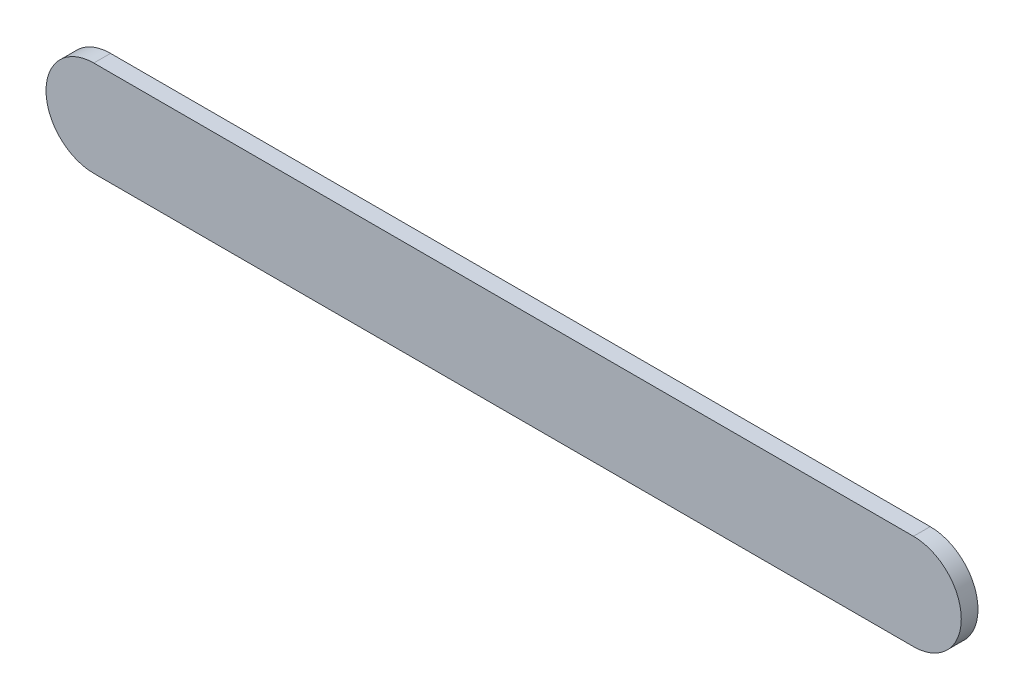
ISO-10303-21;
HEADER;
FILE_DESCRIPTION(('STEP AP214'),'2;1');
FILE_NAME('part.step','',(''),(''),'','','');
FILE_SCHEMA(('AUTOMOTIVE_DESIGN { 1 0 10303 214 1 1 1 1 }'));
ENDSEC;
DATA;
#1=APPLICATION_CONTEXT('core data for automotive mechanical design processes');
#2=APPLICATION_PROTOCOL_DEFINITION('international standard','automotive_design',2000,#1);
#3=PRODUCT_CONTEXT('',#1,'mechanical');
#4=PRODUCT('Part','Part','',(#3));
#5=PRODUCT_RELATED_PRODUCT_CATEGORY('part','',(#4));
#6=PRODUCT_DEFINITION_FORMATION('','',#4);
#7=PRODUCT_DEFINITION_CONTEXT('part definition',#1,'design');
#8=PRODUCT_DEFINITION('design','',#6,#7);
#9=PRODUCT_DEFINITION_SHAPE('','',#8);
#10=(LENGTH_UNIT() NAMED_UNIT(*) SI_UNIT(.MILLI.,.METRE.));
#11=(NAMED_UNIT(*) PLANE_ANGLE_UNIT() SI_UNIT($,.RADIAN.));
#12=(NAMED_UNIT(*) SI_UNIT($,.STERADIAN.) SOLID_ANGLE_UNIT());
#13=UNCERTAINTY_MEASURE_WITH_UNIT(LENGTH_MEASURE(1.E-05),#10,'distance_accuracy_value','');
#14=(GEOMETRIC_REPRESENTATION_CONTEXT(3) GLOBAL_UNCERTAINTY_ASSIGNED_CONTEXT((#13)) GLOBAL_UNIT_ASSIGNED_CONTEXT((#10,
#11,#12)) REPRESENTATION_CONTEXT('',''));
#15=CARTESIAN_POINT('',(0.,0.,0.));
#16=DIRECTION('',(0.,0.,1.));
#17=DIRECTION('',(1.,0.,0.));
#18=AXIS2_PLACEMENT_3D('',#15,#16,#17);
#19=CARTESIAN_POINT('',(89.7,-141.485,1.635));
#20=DIRECTION('',(0.,0.,1.));
#21=DIRECTION('',(1.,0.,0.));
#22=AXIS2_PLACEMENT_3D('',#19,#20,#21);
#23=PLANE('',#22);
#24=DIRECTION('',(-1.,0.,0.));
#25=VECTOR('',#24,1.);
#26=CARTESIAN_POINT('',(89.7,-141.485,1.635));
#27=LINE('',#26,#25);
#28=CARTESIAN_POINT('',(89.7,-141.485,1.635));
#29=VERTEX_POINT('',#28);
#30=CARTESIAN_POINT('',(87.985,-141.485,1.635));
#31=VERTEX_POINT('',#30);
#32=EDGE_CURVE('E70',#29,#31,#27,.T.);
#33=ORIENTED_EDGE('',*,*,#32,.T.);
#34=CARTESIAN_POINT('',(87.985,-141.585,1.635));
#35=DIRECTION('',(0.,0.,1.));
#36=DIRECTION('',(1.42108547152E-13,1.,0.));
#37=AXIS2_PLACEMENT_3D('',#34,#35,#36);
#38=CIRCLE('',#37,0.09999999999999);
#39=CARTESIAN_POINT('',(87.985,-141.685,1.635));
#40=VERTEX_POINT('',#39);
#41=EDGE_CURVE('E68',#31,#40,#38,.T.);
#42=ORIENTED_EDGE('',*,*,#41,.T.);
#43=DIRECTION('',(1.,0.,0.));
#44=VECTOR('',#43,1.);
#45=CARTESIAN_POINT('',(87.985,-141.685,1.635));
#46=LINE('',#45,#44);
#47=CARTESIAN_POINT('',(89.7,-141.685,1.635));
#48=VERTEX_POINT('',#47);
#49=EDGE_CURVE('E56',#40,#48,#46,.T.);
#50=ORIENTED_EDGE('',*,*,#49,.T.);
#51=CARTESIAN_POINT('',(89.7,-141.585,1.635));
#52=DIRECTION('',(0.,0.,1.));
#53=DIRECTION('',(-1.42108547152E-13,-1.,0.));
#54=AXIS2_PLACEMENT_3D('',#51,#52,#53);
#55=CIRCLE('',#54,0.09999999999999);
#56=EDGE_CURVE('E11',#48,#29,#55,.T.);
#57=ORIENTED_EDGE('',*,*,#56,.T.);
#58=EDGE_LOOP('',(#33,#42,#50,#57));
#59=FACE_BOUND('',#58,.T.);
#60=ADVANCED_FACE('F17',(#59),#23,.T.);
#61=CARTESIAN_POINT('',(89.7,-141.485,1.6));
#62=DIRECTION('',(0.,0.,1.));
#63=DIRECTION('',(1.,0.,0.));
#64=AXIS2_PLACEMENT_3D('',#61,#62,#63);
#65=PLANE('',#64);
#66=CARTESIAN_POINT('',(89.7,-141.585,1.6));
#67=DIRECTION('',(0.,0.,1.));
#68=DIRECTION('',(-1.42108547152E-13,-1.,0.));
#69=AXIS2_PLACEMENT_3D('',#66,#67,#68);
#70=CIRCLE('',#69,0.09999999999999);
#71=CARTESIAN_POINT('',(89.7,-141.685,1.6));
#72=VERTEX_POINT('',#71);
#73=CARTESIAN_POINT('',(89.7,-141.485,1.6));
#74=VERTEX_POINT('',#73);
#75=EDGE_CURVE('E26',#72,#74,#70,.T.);
#76=ORIENTED_EDGE('',*,*,#75,.F.);
#77=DIRECTION('',(1.,0.,0.));
#78=VECTOR('',#77,1.);
#79=CARTESIAN_POINT('',(87.985,-141.685,1.6));
#80=LINE('',#79,#78);
#81=CARTESIAN_POINT('',(87.985,-141.685,1.6));
#82=VERTEX_POINT('',#81);
#83=EDGE_CURVE('E75',#82,#72,#80,.T.);
#84=ORIENTED_EDGE('',*,*,#83,.F.);
#85=CARTESIAN_POINT('',(87.985,-141.585,1.6));
#86=DIRECTION('',(0.,0.,1.));
#87=DIRECTION('',(1.42108547152E-13,1.,0.));
#88=AXIS2_PLACEMENT_3D('',#85,#86,#87);
#89=CIRCLE('',#88,0.09999999999999);
#90=CARTESIAN_POINT('',(87.985,-141.485,1.6));
#91=VERTEX_POINT('',#90);
#92=EDGE_CURVE('E79',#91,#82,#89,.T.);
#93=ORIENTED_EDGE('',*,*,#92,.F.);
#94=DIRECTION('',(-1.,0.,0.));
#95=VECTOR('',#94,1.);
#96=CARTESIAN_POINT('',(89.7,-141.485,1.6));
#97=LINE('',#96,#95);
#98=EDGE_CURVE('E104',#74,#91,#97,.T.);
#99=ORIENTED_EDGE('',*,*,#98,.F.);
#100=EDGE_LOOP('',(#76,#84,#93,#99));
#101=FACE_BOUND('',#100,.T.);
#102=ADVANCED_FACE('F122',(#101),#65,.F.);
#103=CARTESIAN_POINT('',(89.7,-141.585,1.6));
#104=DIRECTION('',(0.,0.,-1.));
#105=DIRECTION('',(-1.42108547152E-13,-1.,0.));
#106=AXIS2_PLACEMENT_3D('',#103,#104,#105);
#107=CYLINDRICAL_SURFACE('',#106,0.09999999999999);
#108=ORIENTED_EDGE('',*,*,#75,.T.);
#109=DIRECTION('',(0.,0.,1.));
#110=VECTOR('',#109,1.);
#111=CARTESIAN_POINT('',(89.7,-141.485,1.6));
#112=LINE('',#111,#110);
#113=EDGE_CURVE('E86',#74,#29,#112,.T.);
#114=ORIENTED_EDGE('',*,*,#113,.T.);
#115=ORIENTED_EDGE('',*,*,#56,.F.);
#116=DIRECTION('',(0.,0.,1.));
#117=VECTOR('',#116,1.);
#118=CARTESIAN_POINT('',(89.7,-141.685,1.6));
#119=LINE('',#118,#117);
#120=EDGE_CURVE('E63',#72,#48,#119,.T.);
#121=ORIENTED_EDGE('',*,*,#120,.F.);
#122=EDGE_LOOP('',(#108,#114,#115,#121));
#123=FACE_BOUND('',#122,.T.);
#124=ADVANCED_FACE('F114',(#123),#107,.T.);
#125=CARTESIAN_POINT('',(87.985,-141.685,1.6));
#126=DIRECTION('',(0.,1.,0.));
#127=DIRECTION('',(1.,0.,0.));
#128=AXIS2_PLACEMENT_3D('',#125,#126,#127);
#129=PLANE('',#128);
#130=ORIENTED_EDGE('',*,*,#83,.T.);
#131=ORIENTED_EDGE('',*,*,#120,.T.);
#132=ORIENTED_EDGE('',*,*,#49,.F.);
#133=DIRECTION('',(0.,0.,1.));
#134=VECTOR('',#133,1.);
#135=CARTESIAN_POINT('',(87.985,-141.685,1.6));
#136=LINE('',#135,#134);
#137=EDGE_CURVE('E61',#82,#40,#136,.T.);
#138=ORIENTED_EDGE('',*,*,#137,.F.);
#139=EDGE_LOOP('',(#130,#131,#132,#138));
#140=FACE_BOUND('',#139,.T.);
#141=ADVANCED_FACE('F59',(#140),#129,.F.);
#142=CARTESIAN_POINT('',(87.985,-141.585,1.6));
#143=DIRECTION('',(0.,0.,-1.));
#144=DIRECTION('',(1.42108547152E-13,1.,0.));
#145=AXIS2_PLACEMENT_3D('',#142,#143,#144);
#146=CYLINDRICAL_SURFACE('',#145,0.09999999999999);
#147=ORIENTED_EDGE('',*,*,#92,.T.);
#148=ORIENTED_EDGE('',*,*,#137,.T.);
#149=ORIENTED_EDGE('',*,*,#41,.F.);
#150=DIRECTION('',(0.,0.,1.));
#151=VECTOR('',#150,1.);
#152=CARTESIAN_POINT('',(87.985,-141.485,1.6));
#153=LINE('',#152,#151);
#154=EDGE_CURVE('E101',#91,#31,#153,.T.);
#155=ORIENTED_EDGE('',*,*,#154,.F.);
#156=EDGE_LOOP('',(#147,#148,#149,#155));
#157=FACE_BOUND('',#156,.T.);
#158=ADVANCED_FACE('F77',(#157),#146,.T.);
#159=CARTESIAN_POINT('',(89.7,-141.485,1.6));
#160=DIRECTION('',(0.,-1.,0.));
#161=DIRECTION('',(0.,0.,-1.));
#162=AXIS2_PLACEMENT_3D('',#159,#160,#161);
#163=PLANE('',#162);
#164=ORIENTED_EDGE('',*,*,#98,.T.);
#165=ORIENTED_EDGE('',*,*,#154,.T.);
#166=ORIENTED_EDGE('',*,*,#32,.F.);
#167=ORIENTED_EDGE('',*,*,#113,.F.);
#168=EDGE_LOOP('',(#164,#165,#166,#167));
#169=FACE_BOUND('',#168,.T.);
#170=ADVANCED_FACE('F121',(#169),#163,.F.);
#171=CLOSED_SHELL('',(#60,#102,#124,#141,#158,#170));
#172=MANIFOLD_SOLID_BREP('B1',#171);
#173=ADVANCED_BREP_SHAPE_REPRESENTATION('',(#18,#172),#14);
#174=SHAPE_DEFINITION_REPRESENTATION(#9,#173);
ENDSEC;
END-ISO-10303-21;
